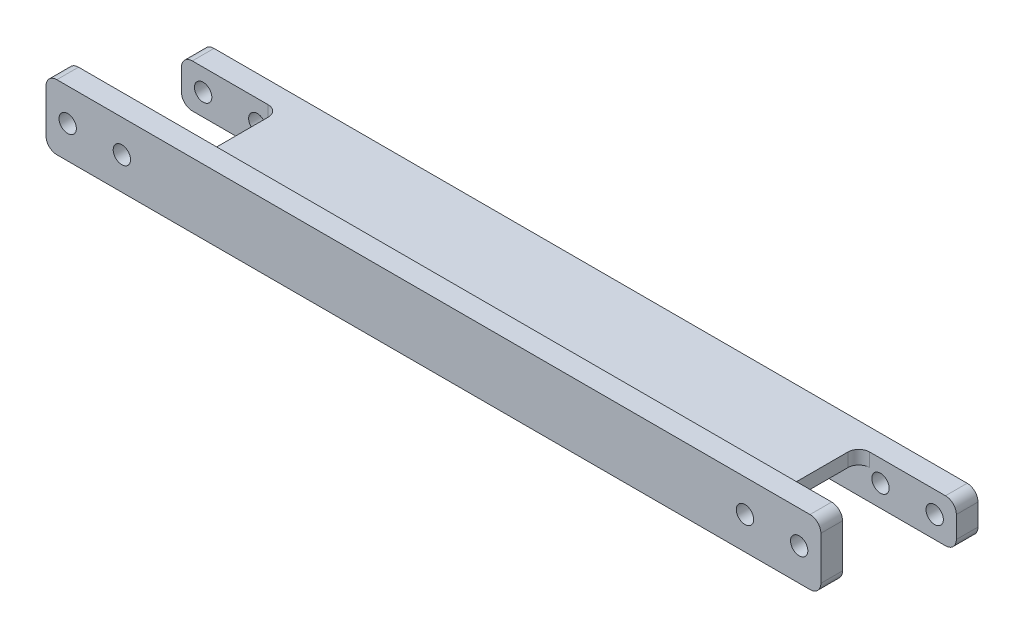
ISO-10303-21;
HEADER;
FILE_DESCRIPTION(('STEP AP214'),'2;1');
FILE_NAME('part.step','',(''),(''),'','','');
FILE_SCHEMA(('AUTOMOTIVE_DESIGN { 1 0 10303 214 1 1 1 1 }'));
ENDSEC;
DATA;
#1=APPLICATION_CONTEXT('core data for automotive mechanical design processes');
#2=APPLICATION_PROTOCOL_DEFINITION('international standard','automotive_design',2000,#1);
#3=PRODUCT_CONTEXT('',#1,'mechanical');
#4=PRODUCT('Part','Part','',(#3));
#5=PRODUCT_RELATED_PRODUCT_CATEGORY('part','',(#4));
#6=PRODUCT_DEFINITION_FORMATION('','',#4);
#7=PRODUCT_DEFINITION_CONTEXT('part definition',#1,'design');
#8=PRODUCT_DEFINITION('design','',#6,#7);
#9=PRODUCT_DEFINITION_SHAPE('','',#8);
#10=(LENGTH_UNIT() NAMED_UNIT(*) SI_UNIT(.MILLI.,.METRE.));
#11=(NAMED_UNIT(*) PLANE_ANGLE_UNIT() SI_UNIT($,.RADIAN.));
#12=(NAMED_UNIT(*) SI_UNIT($,.STERADIAN.) SOLID_ANGLE_UNIT());
#13=UNCERTAINTY_MEASURE_WITH_UNIT(LENGTH_MEASURE(1.E-05),#10,'distance_accuracy_value','');
#14=(GEOMETRIC_REPRESENTATION_CONTEXT(3) GLOBAL_UNCERTAINTY_ASSIGNED_CONTEXT((#13)) GLOBAL_UNIT_ASSIGNED_CONTEXT((#10,
#11,#12)) REPRESENTATION_CONTEXT('',''));
#15=CARTESIAN_POINT('',(0.,0.,0.));
#16=DIRECTION('',(0.,0.,1.));
#17=DIRECTION('',(1.,0.,0.));
#18=AXIS2_PLACEMENT_3D('',#15,#16,#17);
#19=CARTESIAN_POINT('',(0.,0.,4.));
#20=DIRECTION('',(0.,0.,1.));
#21=DIRECTION('',(1.,0.,0.));
#22=AXIS2_PLACEMENT_3D('',#19,#20,#21);
#23=PLANE('',#22);
#24=CARTESIAN_POINT('',(57.5,0.,4.));
#25=DIRECTION('',(0.,0.,1.));
#26=DIRECTION('',(1.,0.,0.));
#27=AXIS2_PLACEMENT_3D('',#24,#25,#26);
#28=CIRCLE('',#27,1.6);
#29=CARTESIAN_POINT('',(59.1,0.,4.));
#30=VERTEX_POINT('',#29);
#31=EDGE_CURVE('E266',#30,#30,#28,.T.);
#32=ORIENTED_EDGE('',*,*,#31,.F.);
#33=EDGE_LOOP('',(#32));
#34=FACE_BOUND('',#33,.T.);
#35=CARTESIAN_POINT('',(-67.5,0.,4.));
#36=DIRECTION('',(0.,0.,1.));
#37=DIRECTION('',(1.,0.,0.));
#38=AXIS2_PLACEMENT_3D('',#35,#36,#37);
#39=CIRCLE('',#38,1.60000000000001);
#40=CARTESIAN_POINT('',(-65.9,0.,4.));
#41=VERTEX_POINT('',#40);
#42=EDGE_CURVE('E278',#41,#41,#39,.T.);
#43=ORIENTED_EDGE('',*,*,#42,.F.);
#44=EDGE_LOOP('',(#43));
#45=FACE_BOUND('',#44,.T.);
#46=CARTESIAN_POINT('',(-57.5,0.,4.));
#47=DIRECTION('',(0.,0.,1.));
#48=DIRECTION('',(1.,0.,0.));
#49=AXIS2_PLACEMENT_3D('',#46,#47,#48);
#50=CIRCLE('',#49,1.6);
#51=CARTESIAN_POINT('',(-55.9,0.,4.));
#52=VERTEX_POINT('',#51);
#53=EDGE_CURVE('E272',#52,#52,#50,.T.);
#54=ORIENTED_EDGE('',*,*,#53,.F.);
#55=EDGE_LOOP('',(#54));
#56=FACE_BOUND('',#55,.T.);
#57=CARTESIAN_POINT('',(67.5,0.,4.));
#58=DIRECTION('',(0.,0.,1.));
#59=DIRECTION('',(1.,0.,0.));
#60=AXIS2_PLACEMENT_3D('',#57,#58,#59);
#61=CIRCLE('',#60,1.60000000000001);
#62=CARTESIAN_POINT('',(69.1,0.,4.));
#63=VERTEX_POINT('',#62);
#64=EDGE_CURVE('E260',#63,#63,#61,.T.);
#65=ORIENTED_EDGE('',*,*,#64,.F.);
#66=EDGE_LOOP('',(#65));
#67=FACE_BOUND('',#66,.T.);
#68=DIRECTION('',(-1.,0.,0.));
#69=VECTOR('',#68,1.);
#70=CARTESIAN_POINT('',(-71.5,4.,4.));
#71=LINE('',#70,#69);
#72=CARTESIAN_POINT('',(69.5,4.,4.));
#73=VERTEX_POINT('',#72);
#74=CARTESIAN_POINT('',(55.5,4.,4.));
#75=VERTEX_POINT('',#74);
#76=EDGE_CURVE('E291',#73,#75,#71,.T.);
#77=ORIENTED_EDGE('',*,*,#76,.T.);
#78=DIRECTION('',(0.,-1.,0.));
#79=VECTOR('',#78,1.);
#80=CARTESIAN_POINT('',(55.5,1.5,4.));
#81=LINE('',#80,#79);
#82=CARTESIAN_POINT('',(55.5,1.5,4.));
#83=VERTEX_POINT('',#82);
#84=EDGE_CURVE('E336',#75,#83,#81,.T.);
#85=ORIENTED_EDGE('',*,*,#84,.T.);
#86=DIRECTION('',(1.,0.,0.));
#87=VECTOR('',#86,1.);
#88=CARTESIAN_POINT('',(0.,1.5,4.));
#89=LINE('',#88,#87);
#90=CARTESIAN_POINT('',(-55.5,1.5,4.));
#91=VERTEX_POINT('',#90);
#92=EDGE_CURVE('E245',#91,#83,#89,.T.);
#93=ORIENTED_EDGE('',*,*,#92,.F.);
#94=DIRECTION('',(0.,-1.,0.));
#95=VECTOR('',#94,1.);
#96=CARTESIAN_POINT('',(-55.5,0.,4.));
#97=LINE('',#96,#95);
#98=CARTESIAN_POINT('',(-55.5,4.,4.));
#99=VERTEX_POINT('',#98);
#100=EDGE_CURVE('E334',#91,#99,#97,.F.);
#101=ORIENTED_EDGE('',*,*,#100,.T.);
#102=CARTESIAN_POINT('',(-69.5,4.,4.));
#103=VERTEX_POINT('',#102);
#104=EDGE_CURVE('E287',#99,#103,#71,.T.);
#105=ORIENTED_EDGE('',*,*,#104,.T.);
#106=CARTESIAN_POINT('',(-69.5,2.,4.));
#107=DIRECTION('',(0.,0.,1.));
#108=DIRECTION('',(1.,0.,0.));
#109=AXIS2_PLACEMENT_3D('',#106,#107,#108);
#110=CIRCLE('',#109,2.);
#111=CARTESIAN_POINT('',(-71.5,2.,4.));
#112=VERTEX_POINT('',#111);
#113=EDGE_CURVE('E330',#103,#112,#110,.T.);
#114=ORIENTED_EDGE('',*,*,#113,.T.);
#115=DIRECTION('',(0.,-1.,0.));
#116=VECTOR('',#115,1.);
#117=CARTESIAN_POINT('',(-71.5,4.,4.));
#118=LINE('',#117,#116);
#119=CARTESIAN_POINT('',(-71.5,-2.,4.));
#120=VERTEX_POINT('',#119);
#121=EDGE_CURVE('E292',#112,#120,#118,.T.);
#122=ORIENTED_EDGE('',*,*,#121,.T.);
#123=CARTESIAN_POINT('',(-69.5,-2.,4.));
#124=DIRECTION('',(0.,0.,1.));
#125=DIRECTION('',(1.,0.,0.));
#126=AXIS2_PLACEMENT_3D('',#123,#124,#125);
#127=CIRCLE('',#126,2.);
#128=CARTESIAN_POINT('',(-69.5,-4.,4.));
#129=VERTEX_POINT('',#128);
#130=EDGE_CURVE('E326',#120,#129,#127,.T.);
#131=ORIENTED_EDGE('',*,*,#130,.T.);
#132=DIRECTION('',(1.,0.,0.));
#133=VECTOR('',#132,1.);
#134=CARTESIAN_POINT('',(-71.5,-4.,4.));
#135=LINE('',#134,#133);
#136=CARTESIAN_POINT('',(69.5,-4.,4.));
#137=VERTEX_POINT('',#136);
#138=EDGE_CURVE('E215',#129,#137,#135,.T.);
#139=ORIENTED_EDGE('',*,*,#138,.T.);
#140=CARTESIAN_POINT('',(69.5,-2.,4.));
#141=DIRECTION('',(0.,0.,1.));
#142=DIRECTION('',(1.,0.,0.));
#143=AXIS2_PLACEMENT_3D('',#140,#141,#142);
#144=CIRCLE('',#143,2.);
#145=CARTESIAN_POINT('',(71.5,-2.,4.));
#146=VERTEX_POINT('',#145);
#147=EDGE_CURVE('E328',#137,#146,#144,.T.);
#148=ORIENTED_EDGE('',*,*,#147,.T.);
#149=DIRECTION('',(0.,1.,0.));
#150=VECTOR('',#149,1.);
#151=CARTESIAN_POINT('',(71.5,4.,4.));
#152=LINE('',#151,#150);
#153=CARTESIAN_POINT('',(71.5,2.,4.));
#154=VERTEX_POINT('',#153);
#155=EDGE_CURVE('E284',#146,#154,#152,.T.);
#156=ORIENTED_EDGE('',*,*,#155,.T.);
#157=CARTESIAN_POINT('',(69.5,2.,4.));
#158=DIRECTION('',(0.,0.,1.));
#159=DIRECTION('',(1.,0.,0.));
#160=AXIS2_PLACEMENT_3D('',#157,#158,#159);
#161=CIRCLE('',#160,2.);
#162=EDGE_CURVE('E332',#154,#73,#161,.T.);
#163=ORIENTED_EDGE('',*,*,#162,.T.);
#164=EDGE_LOOP('',(#77,#85,#93,#101,#105,#114,#122,#131,#139,#148,#156,#163));
#165=FACE_BOUND('',#164,.T.);
#166=ADVANCED_FACE('F43',(#34,#45,#56,#67,#165),#23,.T.);
#167=CARTESIAN_POINT('',(0.,0.,0.));
#168=DIRECTION('',(0.,0.,1.));
#169=DIRECTION('',(1.,0.,0.));
#170=AXIS2_PLACEMENT_3D('',#167,#168,#169);
#171=PLANE('',#170);
#172=DIRECTION('',(-1.,0.,0.));
#173=VECTOR('',#172,1.);
#174=CARTESIAN_POINT('',(-71.5,4.,0.));
#175=LINE('',#174,#173);
#176=CARTESIAN_POINT('',(69.5,4.,0.));
#177=VERTEX_POINT('',#176);
#178=CARTESIAN_POINT('',(-69.5,4.,0.));
#179=VERTEX_POINT('',#178);
#180=EDGE_CURVE('E299',#177,#179,#175,.T.);
#181=ORIENTED_EDGE('',*,*,#180,.F.);
#182=CARTESIAN_POINT('',(69.5,2.,0.));
#183=DIRECTION('',(0.,0.,1.));
#184=DIRECTION('',(1.,0.,0.));
#185=AXIS2_PLACEMENT_3D('',#182,#183,#184);
#186=CIRCLE('',#185,2.);
#187=CARTESIAN_POINT('',(71.5,2.,0.));
#188=VERTEX_POINT('',#187);
#189=EDGE_CURVE('E350',#177,#188,#186,.F.);
#190=ORIENTED_EDGE('',*,*,#189,.T.);
#191=DIRECTION('',(0.,1.,0.));
#192=VECTOR('',#191,1.);
#193=CARTESIAN_POINT('',(71.5,4.,0.));
#194=LINE('',#193,#192);
#195=CARTESIAN_POINT('',(71.5,-2.,0.));
#196=VERTEX_POINT('',#195);
#197=EDGE_CURVE('E281',#196,#188,#194,.T.);
#198=ORIENTED_EDGE('',*,*,#197,.F.);
#199=CARTESIAN_POINT('',(69.5,-2.,0.));
#200=DIRECTION('',(0.,0.,1.));
#201=DIRECTION('',(1.,0.,0.));
#202=AXIS2_PLACEMENT_3D('',#199,#200,#201);
#203=CIRCLE('',#202,2.);
#204=CARTESIAN_POINT('',(69.5,-4.,0.));
#205=VERTEX_POINT('',#204);
#206=EDGE_CURVE('E346',#196,#205,#203,.F.);
#207=ORIENTED_EDGE('',*,*,#206,.T.);
#208=DIRECTION('',(1.,0.,0.));
#209=VECTOR('',#208,1.);
#210=CARTESIAN_POINT('',(-71.5,-4.,0.));
#211=LINE('',#210,#209);
#212=CARTESIAN_POINT('',(-69.5,-4.,0.));
#213=VERTEX_POINT('',#212);
#214=EDGE_CURVE('E288',#213,#205,#211,.T.);
#215=ORIENTED_EDGE('',*,*,#214,.F.);
#216=CARTESIAN_POINT('',(-69.5,-2.,0.));
#217=DIRECTION('',(0.,0.,1.));
#218=DIRECTION('',(1.,0.,0.));
#219=AXIS2_PLACEMENT_3D('',#216,#217,#218);
#220=CIRCLE('',#219,2.);
#221=CARTESIAN_POINT('',(-71.5,-2.,0.));
#222=VERTEX_POINT('',#221);
#223=EDGE_CURVE('E344',#213,#222,#220,.F.);
#224=ORIENTED_EDGE('',*,*,#223,.T.);
#225=DIRECTION('',(0.,-1.,0.));
#226=VECTOR('',#225,1.);
#227=CARTESIAN_POINT('',(-71.5,4.,0.));
#228=LINE('',#227,#226);
#229=CARTESIAN_POINT('',(-71.5,2.,0.));
#230=VERTEX_POINT('',#229);
#231=EDGE_CURVE('E302',#230,#222,#228,.T.);
#232=ORIENTED_EDGE('',*,*,#231,.F.);
#233=CARTESIAN_POINT('',(-69.5,2.,0.));
#234=DIRECTION('',(0.,0.,1.));
#235=DIRECTION('',(1.,0.,0.));
#236=AXIS2_PLACEMENT_3D('',#233,#234,#235);
#237=CIRCLE('',#236,2.);
#238=EDGE_CURVE('E348',#230,#179,#237,.F.);
#239=ORIENTED_EDGE('',*,*,#238,.T.);
#240=EDGE_LOOP('',(#181,#190,#198,#207,#215,#224,#232,#239));
#241=FACE_BOUND('',#240,.T.);
#242=CARTESIAN_POINT('',(-67.5,0.,0.));
#243=DIRECTION('',(0.,0.,1.));
#244=DIRECTION('',(1.,0.,0.));
#245=AXIS2_PLACEMENT_3D('',#242,#243,#244);
#246=CIRCLE('',#245,1.60000000000001);
#247=CARTESIAN_POINT('',(-65.9,0.,0.));
#248=VERTEX_POINT('',#247);
#249=EDGE_CURVE('E275',#248,#248,#246,.T.);
#250=ORIENTED_EDGE('',*,*,#249,.T.);
#251=EDGE_LOOP('',(#250));
#252=FACE_BOUND('',#251,.T.);
#253=CARTESIAN_POINT('',(-57.5,0.,0.));
#254=DIRECTION('',(0.,0.,1.));
#255=DIRECTION('',(1.,0.,0.));
#256=AXIS2_PLACEMENT_3D('',#253,#254,#255);
#257=CIRCLE('',#256,1.6);
#258=CARTESIAN_POINT('',(-55.9,0.,0.));
#259=VERTEX_POINT('',#258);
#260=EDGE_CURVE('E269',#259,#259,#257,.T.);
#261=ORIENTED_EDGE('',*,*,#260,.T.);
#262=EDGE_LOOP('',(#261));
#263=FACE_BOUND('',#262,.T.);
#264=CARTESIAN_POINT('',(57.5,0.,0.));
#265=DIRECTION('',(0.,0.,1.));
#266=DIRECTION('',(1.,0.,0.));
#267=AXIS2_PLACEMENT_3D('',#264,#265,#266);
#268=CIRCLE('',#267,1.6);
#269=CARTESIAN_POINT('',(59.1,0.,0.));
#270=VERTEX_POINT('',#269);
#271=EDGE_CURVE('E263',#270,#270,#268,.T.);
#272=ORIENTED_EDGE('',*,*,#271,.T.);
#273=EDGE_LOOP('',(#272));
#274=FACE_BOUND('',#273,.T.);
#275=CARTESIAN_POINT('',(67.5,0.,0.));
#276=DIRECTION('',(0.,0.,1.));
#277=DIRECTION('',(1.,0.,0.));
#278=AXIS2_PLACEMENT_3D('',#275,#276,#277);
#279=CIRCLE('',#278,1.60000000000001);
#280=CARTESIAN_POINT('',(69.1,0.,0.));
#281=VERTEX_POINT('',#280);
#282=EDGE_CURVE('E259',#281,#281,#279,.T.);
#283=ORIENTED_EDGE('',*,*,#282,.T.);
#284=EDGE_LOOP('',(#283));
#285=FACE_BOUND('',#284,.T.);
#286=ADVANCED_FACE('F520',(#241,#252,#263,#274,#285),#171,.F.);
#287=CARTESIAN_POINT('',(71.5,4.,4.));
#288=DIRECTION('',(-1.,0.,0.));
#289=DIRECTION('',(0.,0.,1.));
#290=AXIS2_PLACEMENT_3D('',#287,#288,#289);
#291=PLANE('',#290);
#292=ORIENTED_EDGE('',*,*,#197,.T.);
#293=DIRECTION('',(0.,0.,-1.));
#294=VECTOR('',#293,1.);
#295=CARTESIAN_POINT('',(71.5,2.,4.));
#296=LINE('',#295,#294);
#297=EDGE_CURVE('E355',#188,#154,#296,.F.);
#298=ORIENTED_EDGE('',*,*,#297,.T.);
#299=ORIENTED_EDGE('',*,*,#155,.F.);
#300=DIRECTION('',(0.,0.,-1.));
#301=VECTOR('',#300,1.);
#302=CARTESIAN_POINT('',(71.5,-2.,4.));
#303=LINE('',#302,#301);
#304=EDGE_CURVE('E352',#146,#196,#303,.T.);
#305=ORIENTED_EDGE('',*,*,#304,.T.);
#306=EDGE_LOOP('',(#292,#298,#299,#305));
#307=FACE_BOUND('',#306,.T.);
#308=ADVANCED_FACE('F442',(#307),#291,.F.);
#309=CARTESIAN_POINT('',(-71.5,4.,4.));
#310=DIRECTION('',(0.,-1.,0.));
#311=DIRECTION('',(0.,0.,-1.));
#312=AXIS2_PLACEMENT_3D('',#309,#310,#311);
#313=PLANE('',#312);
#314=ORIENTED_EDGE('',*,*,#76,.F.);
#315=DIRECTION('',(0.,0.,-1.));
#316=VECTOR('',#315,1.);
#317=CARTESIAN_POINT('',(69.5,4.,4.));
#318=LINE('',#317,#316);
#319=EDGE_CURVE('E341',#73,#177,#318,.T.);
#320=ORIENTED_EDGE('',*,*,#319,.T.);
#321=ORIENTED_EDGE('',*,*,#180,.T.);
#322=DIRECTION('',(0.,0.,-1.));
#323=VECTOR('',#322,1.);
#324=CARTESIAN_POINT('',(-69.5,4.,4.));
#325=LINE('',#324,#323);
#326=EDGE_CURVE('E339',#179,#103,#325,.F.);
#327=ORIENTED_EDGE('',*,*,#326,.T.);
#328=ORIENTED_EDGE('',*,*,#104,.F.);
#329=CARTESIAN_POINT('',(-55.5,4.,6.));
#330=DIRECTION('',(0.,-1.,0.));
#331=DIRECTION('',(0.,0.,-1.));
#332=AXIS2_PLACEMENT_3D('',#329,#330,#331);
#333=CIRCLE('',#332,2.);
#334=CARTESIAN_POINT('',(-53.5,4.,6.00000000000001));
#335=VERTEX_POINT('',#334);
#336=EDGE_CURVE('E11',#99,#335,#333,.T.);
#337=ORIENTED_EDGE('',*,*,#336,.T.);
#338=DIRECTION('',(0.,0.,-1.));
#339=VECTOR('',#338,1.);
#340=CARTESIAN_POINT('',(-53.5,4.,25.));
#341=LINE('',#340,#339);
#342=CARTESIAN_POINT('',(-53.5,4.,23.));
#343=VERTEX_POINT('',#342);
#344=EDGE_CURVE('E253',#343,#335,#341,.T.);
#345=ORIENTED_EDGE('',*,*,#344,.F.);
#346=CARTESIAN_POINT('',(-55.5,4.,23.));
#347=DIRECTION('',(0.,-1.,0.));
#348=DIRECTION('',(0.,0.,-1.));
#349=AXIS2_PLACEMENT_3D('',#346,#347,#348);
#350=CIRCLE('',#349,2.);
#351=CARTESIAN_POINT('',(-55.5,4.,25.));
#352=VERTEX_POINT('',#351);
#353=EDGE_CURVE('E390',#343,#352,#350,.T.);
#354=ORIENTED_EDGE('',*,*,#353,.T.);
#355=DIRECTION('',(-1.,0.,0.));
#356=VECTOR('',#355,1.);
#357=CARTESIAN_POINT('',(0.,4.,25.));
#358=LINE('',#357,#356);
#359=CARTESIAN_POINT('',(55.5,4.,25.));
#360=VERTEX_POINT('',#359);
#361=EDGE_CURVE('E242',#360,#352,#358,.T.);
#362=ORIENTED_EDGE('',*,*,#361,.F.);
#363=CARTESIAN_POINT('',(55.5,4.,23.));
#364=DIRECTION('',(0.,-1.,0.));
#365=DIRECTION('',(0.,0.,-1.));
#366=AXIS2_PLACEMENT_3D('',#363,#364,#365);
#367=CIRCLE('',#366,2.);
#368=CARTESIAN_POINT('',(53.5,4.,23.));
#369=VERTEX_POINT('',#368);
#370=EDGE_CURVE('E395',#360,#369,#367,.T.);
#371=ORIENTED_EDGE('',*,*,#370,.T.);
#372=DIRECTION('',(0.,0.,-1.));
#373=VECTOR('',#372,1.);
#374=CARTESIAN_POINT('',(53.5,4.,25.));
#375=LINE('',#374,#373);
#376=CARTESIAN_POINT('',(53.5,4.,6.00000000000001));
#377=VERTEX_POINT('',#376);
#378=EDGE_CURVE('E256',#369,#377,#375,.T.);
#379=ORIENTED_EDGE('',*,*,#378,.T.);
#380=CARTESIAN_POINT('',(55.5,4.,6.));
#381=DIRECTION('',(0.,-1.,0.));
#382=DIRECTION('',(0.,0.,-1.));
#383=AXIS2_PLACEMENT_3D('',#380,#381,#382);
#384=CIRCLE('',#383,2.);
#385=EDGE_CURVE('E399',#377,#75,#384,.T.);
#386=ORIENTED_EDGE('',*,*,#385,.T.);
#387=EDGE_LOOP('',(#314,#320,#321,#327,#328,#337,#345,#354,#362,#371,#379,#386));
#388=FACE_BOUND('',#387,.T.);
#389=ADVANCED_FACE('F414',(#388),#313,.F.);
#390=CARTESIAN_POINT('',(-71.5,4.,4.));
#391=DIRECTION('',(1.,0.,0.));
#392=DIRECTION('',(0.,0.,-1.));
#393=AXIS2_PLACEMENT_3D('',#390,#391,#392);
#394=PLANE('',#393);
#395=ORIENTED_EDGE('',*,*,#121,.F.);
#396=DIRECTION('',(0.,0.,-1.));
#397=VECTOR('',#396,1.);
#398=CARTESIAN_POINT('',(-71.5,2.,4.));
#399=LINE('',#398,#397);
#400=EDGE_CURVE('E359',#112,#230,#399,.T.);
#401=ORIENTED_EDGE('',*,*,#400,.T.);
#402=ORIENTED_EDGE('',*,*,#231,.T.);
#403=DIRECTION('',(0.,0.,-1.));
#404=VECTOR('',#403,1.);
#405=CARTESIAN_POINT('',(-71.5,-2.,4.));
#406=LINE('',#405,#404);
#407=EDGE_CURVE('E357',#222,#120,#406,.F.);
#408=ORIENTED_EDGE('',*,*,#407,.T.);
#409=EDGE_LOOP('',(#395,#401,#402,#408));
#410=FACE_BOUND('',#409,.T.);
#411=ADVANCED_FACE('F424',(#410),#394,.F.);
#412=CARTESIAN_POINT('',(-71.5,-4.,4.));
#413=DIRECTION('',(0.,1.,0.));
#414=DIRECTION('',(0.,0.,1.));
#415=AXIS2_PLACEMENT_3D('',#412,#413,#414);
#416=PLANE('',#415);
#417=ORIENTED_EDGE('',*,*,#214,.T.);
#418=DIRECTION('',(0.,0.,-1.));
#419=VECTOR('',#418,1.);
#420=CARTESIAN_POINT('',(69.5,-4.,4.));
#421=LINE('',#420,#419);
#422=EDGE_CURVE('E365',#205,#137,#421,.F.);
#423=ORIENTED_EDGE('',*,*,#422,.T.);
#424=ORIENTED_EDGE('',*,*,#138,.F.);
#425=DIRECTION('',(0.,0.,-1.));
#426=VECTOR('',#425,1.);
#427=CARTESIAN_POINT('',(-69.5,-4.,4.));
#428=LINE('',#427,#426);
#429=EDGE_CURVE('E362',#129,#213,#428,.T.);
#430=ORIENTED_EDGE('',*,*,#429,.T.);
#431=EDGE_LOOP('',(#417,#423,#424,#430));
#432=FACE_BOUND('',#431,.T.);
#433=ADVANCED_FACE('F433',(#432),#416,.F.);
#434=CARTESIAN_POINT('',(-67.5,0.,4.));
#435=DIRECTION('',(0.,0.,-1.));
#436=DIRECTION('',(-1.,0.,0.));
#437=AXIS2_PLACEMENT_3D('',#434,#435,#436);
#438=CYLINDRICAL_SURFACE('',#437,1.60000000000001);
#439=ORIENTED_EDGE('',*,*,#42,.T.);
#440=EDGE_LOOP('',(#439));
#441=FACE_BOUND('',#440,.T.);
#442=ORIENTED_EDGE('',*,*,#249,.F.);
#443=EDGE_LOOP('',(#442));
#444=FACE_BOUND('',#443,.T.);
#445=ADVANCED_FACE('F531',(#441,#444),#438,.F.);
#446=CARTESIAN_POINT('',(-57.5,0.,4.));
#447=DIRECTION('',(0.,0.,-1.));
#448=DIRECTION('',(-1.,0.,0.));
#449=AXIS2_PLACEMENT_3D('',#446,#447,#448);
#450=CYLINDRICAL_SURFACE('',#449,1.6);
#451=ORIENTED_EDGE('',*,*,#53,.T.);
#452=EDGE_LOOP('',(#451));
#453=FACE_BOUND('',#452,.T.);
#454=ORIENTED_EDGE('',*,*,#260,.F.);
#455=EDGE_LOOP('',(#454));
#456=FACE_BOUND('',#455,.T.);
#457=ADVANCED_FACE('F821',(#453,#456),#450,.F.);
#458=CARTESIAN_POINT('',(57.5,0.,4.));
#459=DIRECTION('',(0.,0.,-1.));
#460=DIRECTION('',(-1.,0.,0.));
#461=AXIS2_PLACEMENT_3D('',#458,#459,#460);
#462=CYLINDRICAL_SURFACE('',#461,1.6);
#463=ORIENTED_EDGE('',*,*,#31,.T.);
#464=EDGE_LOOP('',(#463));
#465=FACE_BOUND('',#464,.T.);
#466=ORIENTED_EDGE('',*,*,#271,.F.);
#467=EDGE_LOOP('',(#466));
#468=FACE_BOUND('',#467,.T.);
#469=ADVANCED_FACE('F811',(#465,#468),#462,.F.);
#470=CARTESIAN_POINT('',(67.5,0.,4.));
#471=DIRECTION('',(0.,0.,-1.));
#472=DIRECTION('',(-1.,0.,0.));
#473=AXIS2_PLACEMENT_3D('',#470,#471,#472);
#474=CYLINDRICAL_SURFACE('',#473,1.60000000000001);
#475=ORIENTED_EDGE('',*,*,#64,.T.);
#476=EDGE_LOOP('',(#475));
#477=FACE_BOUND('',#476,.T.);
#478=ORIENTED_EDGE('',*,*,#282,.F.);
#479=EDGE_LOOP('',(#478));
#480=FACE_BOUND('',#479,.T.);
#481=ADVANCED_FACE('F722',(#477,#480),#474,.F.);
#482=CARTESIAN_POINT('',(53.5,0.,25.));
#483=DIRECTION('',(1.,0.,0.));
#484=DIRECTION('',(0.,0.,-1.));
#485=AXIS2_PLACEMENT_3D('',#482,#483,#484);
#486=PLANE('',#485);
#487=ORIENTED_EDGE('',*,*,#378,.F.);
#488=DIRECTION('',(0.,-1.,0.));
#489=VECTOR('',#488,1.);
#490=CARTESIAN_POINT('',(53.5,1.5,23.));
#491=LINE('',#490,#489);
#492=CARTESIAN_POINT('',(53.5,1.5,23.));
#493=VERTEX_POINT('',#492);
#494=EDGE_CURVE('E323',#369,#493,#491,.T.);
#495=ORIENTED_EDGE('',*,*,#494,.T.);
#496=DIRECTION('',(0.,0.,-1.));
#497=VECTOR('',#496,1.);
#498=CARTESIAN_POINT('',(53.5,1.5,25.));
#499=LINE('',#498,#497);
#500=CARTESIAN_POINT('',(53.5,1.5,6.00000000000001));
#501=VERTEX_POINT('',#500);
#502=EDGE_CURVE('E244',#493,#501,#499,.T.);
#503=ORIENTED_EDGE('',*,*,#502,.T.);
#504=DIRECTION('',(0.,-1.,0.));
#505=VECTOR('',#504,1.);
#506=CARTESIAN_POINT('',(53.5,4.,6.));
#507=LINE('',#506,#505);
#508=EDGE_CURVE('E321',#501,#377,#507,.F.);
#509=ORIENTED_EDGE('',*,*,#508,.T.);
#510=EDGE_LOOP('',(#487,#495,#503,#509));
#511=FACE_BOUND('',#510,.T.);
#512=ADVANCED_FACE('F456',(#511),#486,.T.);
#513=CARTESIAN_POINT('',(-53.5,0.,25.));
#514=DIRECTION('',(1.,0.,0.));
#515=DIRECTION('',(0.,0.,-1.));
#516=AXIS2_PLACEMENT_3D('',#513,#514,#515);
#517=PLANE('',#516);
#518=DIRECTION('',(0.,0.,-1.));
#519=VECTOR('',#518,1.);
#520=CARTESIAN_POINT('',(-53.5,1.5,25.));
#521=LINE('',#520,#519);
#522=CARTESIAN_POINT('',(-53.5,1.5,23.));
#523=VERTEX_POINT('',#522);
#524=CARTESIAN_POINT('',(-53.5,1.5,6.00000000000001));
#525=VERTEX_POINT('',#524);
#526=EDGE_CURVE('E250',#523,#525,#521,.T.);
#527=ORIENTED_EDGE('',*,*,#526,.F.);
#528=DIRECTION('',(0.,-1.,0.));
#529=VECTOR('',#528,1.);
#530=CARTESIAN_POINT('',(-53.5,0.,23.));
#531=LINE('',#530,#529);
#532=EDGE_CURVE('E319',#523,#343,#531,.F.);
#533=ORIENTED_EDGE('',*,*,#532,.T.);
#534=ORIENTED_EDGE('',*,*,#344,.T.);
#535=DIRECTION('',(0.,-1.,0.));
#536=VECTOR('',#535,1.);
#537=CARTESIAN_POINT('',(-53.5,0.,6.));
#538=LINE('',#537,#536);
#539=EDGE_CURVE('E316',#335,#525,#538,.T.);
#540=ORIENTED_EDGE('',*,*,#539,.T.);
#541=EDGE_LOOP('',(#527,#533,#534,#540));
#542=FACE_BOUND('',#541,.T.);
#543=ADVANCED_FACE('F702',(#542),#517,.F.);
#544=CARTESIAN_POINT('',(0.,1.5,25.));
#545=DIRECTION('',(0.,1.,0.));
#546=DIRECTION('',(0.,0.,1.));
#547=AXIS2_PLACEMENT_3D('',#544,#545,#546);
#548=PLANE('',#547);
#549=DIRECTION('',(1.,0.,0.));
#550=VECTOR('',#549,1.);
#551=CARTESIAN_POINT('',(71.5,1.5,25.));
#552=LINE('',#551,#550);
#553=CARTESIAN_POINT('',(55.5,1.5,25.));
#554=VERTEX_POINT('',#553);
#555=CARTESIAN_POINT('',(69.5,1.5,25.));
#556=VERTEX_POINT('',#555);
#557=EDGE_CURVE('E231',#554,#556,#552,.T.);
#558=ORIENTED_EDGE('',*,*,#557,.T.);
#559=DIRECTION('',(0.,0.,-1.));
#560=VECTOR('',#559,1.);
#561=CARTESIAN_POINT('',(69.5,1.5,25.));
#562=LINE('',#561,#560);
#563=CARTESIAN_POINT('',(69.5,1.5,29.));
#564=VERTEX_POINT('',#563);
#565=EDGE_CURVE('E224',#556,#564,#562,.F.);
#566=ORIENTED_EDGE('',*,*,#565,.T.);
#567=DIRECTION('',(1.,0.,0.));
#568=VECTOR('',#567,1.);
#569=CARTESIAN_POINT('',(71.5,1.5,29.));
#570=LINE('',#569,#568);
#571=CARTESIAN_POINT('',(-69.5,1.5,29.));
#572=VERTEX_POINT('',#571);
#573=EDGE_CURVE('E223',#572,#564,#570,.T.);
#574=ORIENTED_EDGE('',*,*,#573,.F.);
#575=DIRECTION('',(0.,0.,-1.));
#576=VECTOR('',#575,1.);
#577=CARTESIAN_POINT('',(-69.5,1.5,25.));
#578=LINE('',#577,#576);
#579=CARTESIAN_POINT('',(-69.5,1.5,25.));
#580=VERTEX_POINT('',#579);
#581=EDGE_CURVE('E208',#572,#580,#578,.T.);
#582=ORIENTED_EDGE('',*,*,#581,.T.);
#583=CARTESIAN_POINT('',(-55.5,1.5,25.));
#584=VERTEX_POINT('',#583);
#585=EDGE_CURVE('E222',#580,#584,#552,.T.);
#586=ORIENTED_EDGE('',*,*,#585,.T.);
#587=CARTESIAN_POINT('',(-55.5,1.5,23.));
#588=DIRECTION('',(0.,1.,0.));
#589=DIRECTION('',(0.,0.,1.));
#590=AXIS2_PLACEMENT_3D('',#587,#588,#589);
#591=CIRCLE('',#590,2.);
#592=EDGE_CURVE('E388',#584,#523,#591,.T.);
#593=ORIENTED_EDGE('',*,*,#592,.T.);
#594=ORIENTED_EDGE('',*,*,#526,.T.);
#595=CARTESIAN_POINT('',(-55.5,1.5,6.));
#596=DIRECTION('',(0.,1.,0.));
#597=DIRECTION('',(0.,0.,1.));
#598=AXIS2_PLACEMENT_3D('',#595,#596,#597);
#599=CIRCLE('',#598,2.);
#600=EDGE_CURVE('E51',#525,#91,#599,.T.);
#601=ORIENTED_EDGE('',*,*,#600,.T.);
#602=ORIENTED_EDGE('',*,*,#92,.T.);
#603=CARTESIAN_POINT('',(55.5,1.5,6.));
#604=DIRECTION('',(0.,1.,0.));
#605=DIRECTION('',(0.,0.,1.));
#606=AXIS2_PLACEMENT_3D('',#603,#604,#605);
#607=CIRCLE('',#606,2.);
#608=EDGE_CURVE('E397',#83,#501,#607,.T.);
#609=ORIENTED_EDGE('',*,*,#608,.T.);
#610=ORIENTED_EDGE('',*,*,#502,.F.);
#611=CARTESIAN_POINT('',(55.5,1.5,23.));
#612=DIRECTION('',(0.,1.,0.));
#613=DIRECTION('',(0.,0.,1.));
#614=AXIS2_PLACEMENT_3D('',#611,#612,#613);
#615=CIRCLE('',#614,2.);
#616=EDGE_CURVE('E393',#493,#554,#615,.T.);
#617=ORIENTED_EDGE('',*,*,#616,.T.);
#618=EDGE_LOOP('',(#558,#566,#574,#582,#586,#593,#594,#601,#602,#609,#610,#617));
#619=FACE_BOUND('',#618,.T.);
#620=ADVANCED_FACE('F221',(#619),#548,.F.);
#621=CARTESIAN_POINT('',(0.,0.,25.));
#622=DIRECTION('',(0.,0.,-1.));
#623=DIRECTION('',(-1.,0.,0.));
#624=AXIS2_PLACEMENT_3D('',#621,#622,#623);
#625=PLANE('',#624);
#626=CARTESIAN_POINT('',(-57.5,7.5,25.));
#627=DIRECTION('',(0.,0.,1.));
#628=DIRECTION('',(1.,0.,0.));
#629=AXIS2_PLACEMENT_3D('',#626,#627,#628);
#630=CIRCLE('',#629,1.6);
#631=CARTESIAN_POINT('',(-55.9,7.5,25.));
#632=VERTEX_POINT('',#631);
#633=EDGE_CURVE('E496',#632,#632,#630,.T.);
#634=ORIENTED_EDGE('',*,*,#633,.T.);
#635=EDGE_LOOP('',(#634));
#636=FACE_BOUND('',#635,.T.);
#637=CARTESIAN_POINT('',(57.5,7.5,25.));
#638=DIRECTION('',(0.,0.,1.));
#639=DIRECTION('',(1.,0.,0.));
#640=AXIS2_PLACEMENT_3D('',#637,#638,#639);
#641=CIRCLE('',#640,1.6);
#642=CARTESIAN_POINT('',(59.1,7.5,25.));
#643=VERTEX_POINT('',#642);
#644=EDGE_CURVE('E484',#643,#643,#641,.T.);
#645=ORIENTED_EDGE('',*,*,#644,.T.);
#646=EDGE_LOOP('',(#645));
#647=FACE_BOUND('',#646,.T.);
#648=CARTESIAN_POINT('',(67.5,7.5,25.));
#649=DIRECTION('',(0.,0.,1.));
#650=DIRECTION('',(1.,0.,0.));
#651=AXIS2_PLACEMENT_3D('',#648,#649,#650);
#652=CIRCLE('',#651,1.6);
#653=CARTESIAN_POINT('',(69.1,7.5,25.));
#654=VERTEX_POINT('',#653);
#655=EDGE_CURVE('E477',#654,#654,#652,.T.);
#656=ORIENTED_EDGE('',*,*,#655,.T.);
#657=EDGE_LOOP('',(#656));
#658=FACE_BOUND('',#657,.T.);
#659=CARTESIAN_POINT('',(-67.5,7.5,25.));
#660=DIRECTION('',(0.,0.,1.));
#661=DIRECTION('',(1.,0.,0.));
#662=AXIS2_PLACEMENT_3D('',#659,#660,#661);
#663=CIRCLE('',#662,1.60000000000001);
#664=CARTESIAN_POINT('',(-65.9,7.5,25.));
#665=VERTEX_POINT('',#664);
#666=EDGE_CURVE('E490',#665,#665,#663,.T.);
#667=ORIENTED_EDGE('',*,*,#666,.T.);
#668=EDGE_LOOP('',(#667));
#669=FACE_BOUND('',#668,.T.);
#670=ORIENTED_EDGE('',*,*,#361,.T.);
#671=DIRECTION('',(0.,-1.,0.));
#672=VECTOR('',#671,1.);
#673=CARTESIAN_POINT('',(-55.5,0.,25.));
#674=LINE('',#673,#672);
#675=EDGE_CURVE('E229',#352,#584,#674,.T.);
#676=ORIENTED_EDGE('',*,*,#675,.T.);
#677=ORIENTED_EDGE('',*,*,#585,.F.);
#678=CARTESIAN_POINT('',(-69.5,3.5,25.));
#679=DIRECTION('',(0.,0.,-1.));
#680=DIRECTION('',(-1.,0.,0.));
#681=AXIS2_PLACEMENT_3D('',#678,#679,#680);
#682=CIRCLE('',#681,2.);
#683=CARTESIAN_POINT('',(-71.5,3.5,25.));
#684=VERTEX_POINT('',#683);
#685=EDGE_CURVE('E205',#580,#684,#682,.T.);
#686=ORIENTED_EDGE('',*,*,#685,.T.);
#687=DIRECTION('',(0.,-1.,0.));
#688=VECTOR('',#687,1.);
#689=CARTESIAN_POINT('',(-71.5,13.5,25.));
#690=LINE('',#689,#688);
#691=CARTESIAN_POINT('',(-71.5,11.5,25.));
#692=VERTEX_POINT('',#691);
#693=EDGE_CURVE('E235',#692,#684,#690,.T.);
#694=ORIENTED_EDGE('',*,*,#693,.F.);
#695=CARTESIAN_POINT('',(-69.5,11.5,25.));
#696=DIRECTION('',(0.,0.,-1.));
#697=DIRECTION('',(-1.,0.,0.));
#698=AXIS2_PLACEMENT_3D('',#695,#696,#697);
#699=CIRCLE('',#698,2.);
#700=CARTESIAN_POINT('',(-69.5,13.5,25.));
#701=VERTEX_POINT('',#700);
#702=EDGE_CURVE('E310',#692,#701,#699,.T.);
#703=ORIENTED_EDGE('',*,*,#702,.T.);
#704=DIRECTION('',(-1.,0.,0.));
#705=VECTOR('',#704,1.);
#706=CARTESIAN_POINT('',(71.5,13.5,25.));
#707=LINE('',#706,#705);
#708=CARTESIAN_POINT('',(69.5,13.5,25.));
#709=VERTEX_POINT('',#708);
#710=EDGE_CURVE('E233',#709,#701,#707,.T.);
#711=ORIENTED_EDGE('',*,*,#710,.F.);
#712=CARTESIAN_POINT('',(69.5,11.5,25.));
#713=DIRECTION('',(0.,0.,-1.));
#714=DIRECTION('',(-1.,0.,0.));
#715=AXIS2_PLACEMENT_3D('',#712,#713,#714);
#716=CIRCLE('',#715,2.);
#717=CARTESIAN_POINT('',(71.5,11.5,25.));
#718=VERTEX_POINT('',#717);
#719=EDGE_CURVE('E308',#709,#718,#716,.T.);
#720=ORIENTED_EDGE('',*,*,#719,.T.);
#721=DIRECTION('',(0.,1.,0.));
#722=VECTOR('',#721,1.);
#723=CARTESIAN_POINT('',(71.5,13.5,25.));
#724=LINE('',#723,#722);
#725=CARTESIAN_POINT('',(71.5,3.5,25.));
#726=VERTEX_POINT('',#725);
#727=EDGE_CURVE('E230',#726,#718,#724,.T.);
#728=ORIENTED_EDGE('',*,*,#727,.F.);
#729=CARTESIAN_POINT('',(69.5,3.5,25.));
#730=DIRECTION('',(0.,0.,-1.));
#731=DIRECTION('',(-1.,0.,0.));
#732=AXIS2_PLACEMENT_3D('',#729,#730,#731);
#733=CIRCLE('',#732,2.);
#734=EDGE_CURVE('E214',#726,#556,#733,.T.);
#735=ORIENTED_EDGE('',*,*,#734,.T.);
#736=ORIENTED_EDGE('',*,*,#557,.F.);
#737=DIRECTION('',(0.,-1.,0.));
#738=VECTOR('',#737,1.);
#739=CARTESIAN_POINT('',(55.5,4.,25.));
#740=LINE('',#739,#738);
#741=EDGE_CURVE('E312',#554,#360,#740,.F.);
#742=ORIENTED_EDGE('',*,*,#741,.T.);
#743=EDGE_LOOP('',(#670,#676,#677,#686,#694,#703,#711,#720,#728,#735,#736,#742));
#744=FACE_BOUND('',#743,.T.);
#745=ADVANCED_FACE('F227',(#636,#647,#658,#669,#744),#625,.T.);
#746=CARTESIAN_POINT('',(0.,0.,29.));
#747=DIRECTION('',(0.,0.,-1.));
#748=DIRECTION('',(-1.,0.,0.));
#749=AXIS2_PLACEMENT_3D('',#746,#747,#748);
#750=PLANE('',#749);
#751=DIRECTION('',(-1.,0.,0.));
#752=VECTOR('',#751,1.);
#753=CARTESIAN_POINT('',(71.5,13.5,29.));
#754=LINE('',#753,#752);
#755=CARTESIAN_POINT('',(69.5,13.5,29.));
#756=VERTEX_POINT('',#755);
#757=CARTESIAN_POINT('',(-69.5,13.5,29.));
#758=VERTEX_POINT('',#757);
#759=EDGE_CURVE('E247',#756,#758,#754,.T.);
#760=ORIENTED_EDGE('',*,*,#759,.T.);
#761=CARTESIAN_POINT('',(-69.5,11.5,29.));
#762=DIRECTION('',(0.,0.,-1.));
#763=DIRECTION('',(-1.,0.,0.));
#764=AXIS2_PLACEMENT_3D('',#761,#762,#763);
#765=CIRCLE('',#764,2.);
#766=CARTESIAN_POINT('',(-71.5,11.5,29.));
#767=VERTEX_POINT('',#766);
#768=EDGE_CURVE('E381',#758,#767,#765,.F.);
#769=ORIENTED_EDGE('',*,*,#768,.T.);
#770=DIRECTION('',(0.,-1.,0.));
#771=VECTOR('',#770,1.);
#772=CARTESIAN_POINT('',(-71.5,13.5,29.));
#773=LINE('',#772,#771);
#774=CARTESIAN_POINT('',(-71.5,3.5,29.));
#775=VERTEX_POINT('',#774);
#776=EDGE_CURVE('E241',#767,#775,#773,.T.);
#777=ORIENTED_EDGE('',*,*,#776,.T.);
#778=CARTESIAN_POINT('',(-69.5,3.5,29.));
#779=DIRECTION('',(0.,0.,-1.));
#780=DIRECTION('',(-1.,0.,0.));
#781=AXIS2_PLACEMENT_3D('',#778,#779,#780);
#782=CIRCLE('',#781,2.);
#783=EDGE_CURVE('E376',#775,#572,#782,.F.);
#784=ORIENTED_EDGE('',*,*,#783,.T.);
#785=ORIENTED_EDGE('',*,*,#573,.T.);
#786=CARTESIAN_POINT('',(69.5,3.5,29.));
#787=DIRECTION('',(0.,0.,-1.));
#788=DIRECTION('',(-1.,0.,0.));
#789=AXIS2_PLACEMENT_3D('',#786,#787,#788);
#790=CIRCLE('',#789,2.);
#791=CARTESIAN_POINT('',(71.5,3.5,29.));
#792=VERTEX_POINT('',#791);
#793=EDGE_CURVE('E65',#564,#792,#790,.F.);
#794=ORIENTED_EDGE('',*,*,#793,.T.);
#795=DIRECTION('',(0.,1.,0.));
#796=VECTOR('',#795,1.);
#797=CARTESIAN_POINT('',(71.5,13.5,29.));
#798=LINE('',#797,#796);
#799=CARTESIAN_POINT('',(71.5,11.5,29.));
#800=VERTEX_POINT('',#799);
#801=EDGE_CURVE('E469',#792,#800,#798,.T.);
#802=ORIENTED_EDGE('',*,*,#801,.T.);
#803=CARTESIAN_POINT('',(69.5,11.5,29.));
#804=DIRECTION('',(0.,0.,-1.));
#805=DIRECTION('',(-1.,0.,0.));
#806=AXIS2_PLACEMENT_3D('',#803,#804,#805);
#807=CIRCLE('',#806,2.);
#808=EDGE_CURVE('E379',#800,#756,#807,.F.);
#809=ORIENTED_EDGE('',*,*,#808,.T.);
#810=EDGE_LOOP('',(#760,#769,#777,#784,#785,#794,#802,#809));
#811=FACE_BOUND('',#810,.T.);
#812=CARTESIAN_POINT('',(67.5,7.5,29.));
#813=DIRECTION('',(0.,0.,1.));
#814=DIRECTION('',(1.,0.,0.));
#815=AXIS2_PLACEMENT_3D('',#812,#813,#814);
#816=CIRCLE('',#815,1.6);
#817=CARTESIAN_POINT('',(69.1,7.5,29.));
#818=VERTEX_POINT('',#817);
#819=EDGE_CURVE('E480',#818,#818,#816,.T.);
#820=ORIENTED_EDGE('',*,*,#819,.F.);
#821=EDGE_LOOP('',(#820));
#822=FACE_BOUND('',#821,.T.);
#823=CARTESIAN_POINT('',(57.5,7.5,29.));
#824=DIRECTION('',(0.,0.,1.));
#825=DIRECTION('',(1.,0.,0.));
#826=AXIS2_PLACEMENT_3D('',#823,#824,#825);
#827=CIRCLE('',#826,1.6);
#828=CARTESIAN_POINT('',(59.1,7.5,29.));
#829=VERTEX_POINT('',#828);
#830=EDGE_CURVE('E481',#829,#829,#827,.T.);
#831=ORIENTED_EDGE('',*,*,#830,.F.);
#832=EDGE_LOOP('',(#831));
#833=FACE_BOUND('',#832,.T.);
#834=CARTESIAN_POINT('',(-67.5,7.5,29.));
#835=DIRECTION('',(0.,0.,1.));
#836=DIRECTION('',(1.,0.,0.));
#837=AXIS2_PLACEMENT_3D('',#834,#835,#836);
#838=CIRCLE('',#837,1.60000000000001);
#839=CARTESIAN_POINT('',(-65.9,7.5,29.));
#840=VERTEX_POINT('',#839);
#841=EDGE_CURVE('E487',#840,#840,#838,.T.);
#842=ORIENTED_EDGE('',*,*,#841,.F.);
#843=EDGE_LOOP('',(#842));
#844=FACE_BOUND('',#843,.T.);
#845=CARTESIAN_POINT('',(-57.5,7.5,29.));
#846=DIRECTION('',(0.,0.,1.));
#847=DIRECTION('',(1.,0.,0.));
#848=AXIS2_PLACEMENT_3D('',#845,#846,#847);
#849=CIRCLE('',#848,1.6);
#850=CARTESIAN_POINT('',(-55.9,7.5,29.));
#851=VERTEX_POINT('',#850);
#852=EDGE_CURVE('E493',#851,#851,#849,.T.);
#853=ORIENTED_EDGE('',*,*,#852,.F.);
#854=EDGE_LOOP('',(#853));
#855=FACE_BOUND('',#854,.T.);
#856=ADVANCED_FACE('F505',(#811,#822,#833,#844,#855),#750,.F.);
#857=CARTESIAN_POINT('',(-71.5,13.5,29.));
#858=DIRECTION('',(1.,0.,0.));
#859=DIRECTION('',(0.,0.,-1.));
#860=AXIS2_PLACEMENT_3D('',#857,#858,#859);
#861=PLANE('',#860);
#862=ORIENTED_EDGE('',*,*,#776,.F.);
#863=DIRECTION('',(0.,0.,-1.));
#864=VECTOR('',#863,1.);
#865=CARTESIAN_POINT('',(-71.5,11.5,29.));
#866=LINE('',#865,#864);
#867=EDGE_CURVE('E368',#767,#692,#866,.T.);
#868=ORIENTED_EDGE('',*,*,#867,.T.);
#869=ORIENTED_EDGE('',*,*,#693,.T.);
#870=DIRECTION('',(0.,0.,-1.));
#871=VECTOR('',#870,1.);
#872=CARTESIAN_POINT('',(-71.5,3.5,29.));
#873=LINE('',#872,#871);
#874=EDGE_CURVE('E209',#684,#775,#873,.F.);
#875=ORIENTED_EDGE('',*,*,#874,.T.);
#876=EDGE_LOOP('',(#862,#868,#869,#875));
#877=FACE_BOUND('',#876,.T.);
#878=ADVANCED_FACE('F507',(#877),#861,.F.);
#879=CARTESIAN_POINT('',(71.5,13.5,29.));
#880=DIRECTION('',(-1.,0.,0.));
#881=DIRECTION('',(0.,0.,1.));
#882=AXIS2_PLACEMENT_3D('',#879,#880,#881);
#883=PLANE('',#882);
#884=ORIENTED_EDGE('',*,*,#727,.T.);
#885=DIRECTION('',(0.,0.,-1.));
#886=VECTOR('',#885,1.);
#887=CARTESIAN_POINT('',(71.5,11.5,29.));
#888=LINE('',#887,#886);
#889=EDGE_CURVE('E58',#718,#800,#888,.F.);
#890=ORIENTED_EDGE('',*,*,#889,.T.);
#891=ORIENTED_EDGE('',*,*,#801,.F.);
#892=DIRECTION('',(0.,0.,-1.));
#893=VECTOR('',#892,1.);
#894=CARTESIAN_POINT('',(71.5,3.5,29.));
#895=LINE('',#894,#893);
#896=EDGE_CURVE('E383',#792,#726,#895,.T.);
#897=ORIENTED_EDGE('',*,*,#896,.T.);
#898=EDGE_LOOP('',(#884,#890,#891,#897));
#899=FACE_BOUND('',#898,.T.);
#900=ADVANCED_FACE('F468',(#899),#883,.F.);
#901=CARTESIAN_POINT('',(71.5,13.5,29.));
#902=DIRECTION('',(0.,-1.,0.));
#903=DIRECTION('',(0.,0.,-1.));
#904=AXIS2_PLACEMENT_3D('',#901,#902,#903);
#905=PLANE('',#904);
#906=ORIENTED_EDGE('',*,*,#710,.T.);
#907=DIRECTION('',(0.,0.,-1.));
#908=VECTOR('',#907,1.);
#909=CARTESIAN_POINT('',(-69.5,13.5,29.));
#910=LINE('',#909,#908);
#911=EDGE_CURVE('E374',#701,#758,#910,.F.);
#912=ORIENTED_EDGE('',*,*,#911,.T.);
#913=ORIENTED_EDGE('',*,*,#759,.F.);
#914=DIRECTION('',(0.,0.,-1.));
#915=VECTOR('',#914,1.);
#916=CARTESIAN_POINT('',(69.5,13.5,29.));
#917=LINE('',#916,#915);
#918=EDGE_CURVE('E371',#756,#709,#917,.T.);
#919=ORIENTED_EDGE('',*,*,#918,.T.);
#920=EDGE_LOOP('',(#906,#912,#913,#919));
#921=FACE_BOUND('',#920,.T.);
#922=ADVANCED_FACE('F656',(#921),#905,.F.);
#923=CARTESIAN_POINT('',(67.5,7.5,29.));
#924=DIRECTION('',(0.,0.,-1.));
#925=DIRECTION('',(-1.,0.,0.));
#926=AXIS2_PLACEMENT_3D('',#923,#924,#925);
#927=CYLINDRICAL_SURFACE('',#926,1.6);
#928=ORIENTED_EDGE('',*,*,#819,.T.);
#929=EDGE_LOOP('',(#928));
#930=FACE_BOUND('',#929,.T.);
#931=ORIENTED_EDGE('',*,*,#655,.F.);
#932=EDGE_LOOP('',(#931));
#933=FACE_BOUND('',#932,.T.);
#934=ADVANCED_FACE('F661',(#930,#933),#927,.F.);
#935=CARTESIAN_POINT('',(57.5,7.5,29.));
#936=DIRECTION('',(0.,0.,-1.));
#937=DIRECTION('',(-1.,0.,0.));
#938=AXIS2_PLACEMENT_3D('',#935,#936,#937);
#939=CYLINDRICAL_SURFACE('',#938,1.6);
#940=ORIENTED_EDGE('',*,*,#830,.T.);
#941=EDGE_LOOP('',(#940));
#942=FACE_BOUND('',#941,.T.);
#943=ORIENTED_EDGE('',*,*,#644,.F.);
#944=EDGE_LOOP('',(#943));
#945=FACE_BOUND('',#944,.T.);
#946=ADVANCED_FACE('F784',(#942,#945),#939,.F.);
#947=CARTESIAN_POINT('',(-67.5,7.5,29.));
#948=DIRECTION('',(0.,0.,-1.));
#949=DIRECTION('',(-1.,0.,0.));
#950=AXIS2_PLACEMENT_3D('',#947,#948,#949);
#951=CYLINDRICAL_SURFACE('',#950,1.60000000000001);
#952=ORIENTED_EDGE('',*,*,#841,.T.);
#953=EDGE_LOOP('',(#952));
#954=FACE_BOUND('',#953,.T.);
#955=ORIENTED_EDGE('',*,*,#666,.F.);
#956=EDGE_LOOP('',(#955));
#957=FACE_BOUND('',#956,.T.);
#958=ADVANCED_FACE('F774',(#954,#957),#951,.F.);
#959=CARTESIAN_POINT('',(-57.5,7.5,29.));
#960=DIRECTION('',(0.,0.,-1.));
#961=DIRECTION('',(-1.,0.,0.));
#962=AXIS2_PLACEMENT_3D('',#959,#960,#961);
#963=CYLINDRICAL_SURFACE('',#962,1.6);
#964=ORIENTED_EDGE('',*,*,#852,.T.);
#965=EDGE_LOOP('',(#964));
#966=FACE_BOUND('',#965,.T.);
#967=ORIENTED_EDGE('',*,*,#633,.F.);
#968=EDGE_LOOP('',(#967));
#969=FACE_BOUND('',#968,.T.);
#970=ADVANCED_FACE('F502',(#966,#969),#963,.F.);
#971=CARTESIAN_POINT('',(-55.5,0.,23.));
#972=DIRECTION('',(0.,-1.,0.));
#973=DIRECTION('',(0.,0.,-1.));
#974=AXIS2_PLACEMENT_3D('',#971,#972,#973);
#975=CYLINDRICAL_SURFACE('',#974,2.);
#976=ORIENTED_EDGE('',*,*,#353,.F.);
#977=ORIENTED_EDGE('',*,*,#532,.F.);
#978=ORIENTED_EDGE('',*,*,#592,.F.);
#979=ORIENTED_EDGE('',*,*,#675,.F.);
#980=EDGE_LOOP('',(#976,#977,#978,#979));
#981=FACE_BOUND('',#980,.T.);
#982=ADVANCED_FACE('F542',(#981),#975,.F.);
#983=CARTESIAN_POINT('',(55.5,0.,23.));
#984=DIRECTION('',(0.,1.,0.));
#985=DIRECTION('',(0.,0.,1.));
#986=AXIS2_PLACEMENT_3D('',#983,#984,#985);
#987=CYLINDRICAL_SURFACE('',#986,2.);
#988=ORIENTED_EDGE('',*,*,#370,.F.);
#989=ORIENTED_EDGE('',*,*,#741,.F.);
#990=ORIENTED_EDGE('',*,*,#616,.F.);
#991=ORIENTED_EDGE('',*,*,#494,.F.);
#992=EDGE_LOOP('',(#988,#989,#990,#991));
#993=FACE_BOUND('',#992,.T.);
#994=ADVANCED_FACE('F460',(#993),#987,.F.);
#995=CARTESIAN_POINT('',(55.5,0.,6.));
#996=DIRECTION('',(0.,1.,0.));
#997=DIRECTION('',(0.,0.,1.));
#998=AXIS2_PLACEMENT_3D('',#995,#996,#997);
#999=CYLINDRICAL_SURFACE('',#998,2.);
#1000=ORIENTED_EDGE('',*,*,#385,.F.);
#1001=ORIENTED_EDGE('',*,*,#508,.F.);
#1002=ORIENTED_EDGE('',*,*,#608,.F.);
#1003=ORIENTED_EDGE('',*,*,#84,.F.);
#1004=EDGE_LOOP('',(#1000,#1001,#1002,#1003));
#1005=FACE_BOUND('',#1004,.T.);
#1006=ADVANCED_FACE('F453',(#1005),#999,.F.);
#1007=CARTESIAN_POINT('',(-55.5,0.,6.));
#1008=DIRECTION('',(0.,-1.,0.));
#1009=DIRECTION('',(0.,0.,-1.));
#1010=AXIS2_PLACEMENT_3D('',#1007,#1008,#1009);
#1011=CYLINDRICAL_SURFACE('',#1010,2.);
#1012=ORIENTED_EDGE('',*,*,#336,.F.);
#1013=ORIENTED_EDGE('',*,*,#100,.F.);
#1014=ORIENTED_EDGE('',*,*,#600,.F.);
#1015=ORIENTED_EDGE('',*,*,#539,.F.);
#1016=EDGE_LOOP('',(#1012,#1013,#1014,#1015));
#1017=FACE_BOUND('',#1016,.T.);
#1018=ADVANCED_FACE('F407',(#1017),#1011,.F.);
#1019=CARTESIAN_POINT('',(69.5,2.,4.));
#1020=DIRECTION('',(0.,0.,-1.));
#1021=DIRECTION('',(-1.,0.,0.));
#1022=AXIS2_PLACEMENT_3D('',#1019,#1020,#1021);
#1023=CYLINDRICAL_SURFACE('',#1022,2.);
#1024=ORIENTED_EDGE('',*,*,#162,.F.);
#1025=ORIENTED_EDGE('',*,*,#297,.F.);
#1026=ORIENTED_EDGE('',*,*,#189,.F.);
#1027=ORIENTED_EDGE('',*,*,#319,.F.);
#1028=EDGE_LOOP('',(#1024,#1025,#1026,#1027));
#1029=FACE_BOUND('',#1028,.T.);
#1030=ADVANCED_FACE('F446',(#1029),#1023,.T.);
#1031=CARTESIAN_POINT('',(-69.5,2.,4.));
#1032=DIRECTION('',(0.,0.,-1.));
#1033=DIRECTION('',(-1.,0.,0.));
#1034=AXIS2_PLACEMENT_3D('',#1031,#1032,#1033);
#1035=CYLINDRICAL_SURFACE('',#1034,2.);
#1036=ORIENTED_EDGE('',*,*,#113,.F.);
#1037=ORIENTED_EDGE('',*,*,#326,.F.);
#1038=ORIENTED_EDGE('',*,*,#238,.F.);
#1039=ORIENTED_EDGE('',*,*,#400,.F.);
#1040=EDGE_LOOP('',(#1036,#1037,#1038,#1039));
#1041=FACE_BOUND('',#1040,.T.);
#1042=ADVANCED_FACE('F419',(#1041),#1035,.T.);
#1043=CARTESIAN_POINT('',(69.5,-2.,4.));
#1044=DIRECTION('',(0.,0.,-1.));
#1045=DIRECTION('',(-1.,0.,0.));
#1046=AXIS2_PLACEMENT_3D('',#1043,#1044,#1045);
#1047=CYLINDRICAL_SURFACE('',#1046,2.);
#1048=ORIENTED_EDGE('',*,*,#147,.F.);
#1049=ORIENTED_EDGE('',*,*,#422,.F.);
#1050=ORIENTED_EDGE('',*,*,#206,.F.);
#1051=ORIENTED_EDGE('',*,*,#304,.F.);
#1052=EDGE_LOOP('',(#1048,#1049,#1050,#1051));
#1053=FACE_BOUND('',#1052,.T.);
#1054=ADVANCED_FACE('F437',(#1053),#1047,.T.);
#1055=CARTESIAN_POINT('',(-69.5,-2.,4.));
#1056=DIRECTION('',(0.,0.,-1.));
#1057=DIRECTION('',(-1.,0.,0.));
#1058=AXIS2_PLACEMENT_3D('',#1055,#1056,#1057);
#1059=CYLINDRICAL_SURFACE('',#1058,2.);
#1060=ORIENTED_EDGE('',*,*,#130,.F.);
#1061=ORIENTED_EDGE('',*,*,#407,.F.);
#1062=ORIENTED_EDGE('',*,*,#223,.F.);
#1063=ORIENTED_EDGE('',*,*,#429,.F.);
#1064=EDGE_LOOP('',(#1060,#1061,#1062,#1063));
#1065=FACE_BOUND('',#1064,.T.);
#1066=ADVANCED_FACE('F428',(#1065),#1059,.T.);
#1067=CARTESIAN_POINT('',(-69.5,11.5,29.));
#1068=DIRECTION('',(0.,0.,-1.));
#1069=DIRECTION('',(-1.,0.,0.));
#1070=AXIS2_PLACEMENT_3D('',#1067,#1068,#1069);
#1071=CYLINDRICAL_SURFACE('',#1070,2.);
#1072=ORIENTED_EDGE('',*,*,#768,.F.);
#1073=ORIENTED_EDGE('',*,*,#911,.F.);
#1074=ORIENTED_EDGE('',*,*,#702,.F.);
#1075=ORIENTED_EDGE('',*,*,#867,.F.);
#1076=EDGE_LOOP('',(#1072,#1073,#1074,#1075));
#1077=FACE_BOUND('',#1076,.T.);
#1078=ADVANCED_FACE('F560',(#1077),#1071,.T.);
#1079=CARTESIAN_POINT('',(69.5,11.5,29.));
#1080=DIRECTION('',(0.,0.,-1.));
#1081=DIRECTION('',(-1.,0.,0.));
#1082=AXIS2_PLACEMENT_3D('',#1079,#1080,#1081);
#1083=CYLINDRICAL_SURFACE('',#1082,2.);
#1084=ORIENTED_EDGE('',*,*,#808,.F.);
#1085=ORIENTED_EDGE('',*,*,#889,.F.);
#1086=ORIENTED_EDGE('',*,*,#719,.F.);
#1087=ORIENTED_EDGE('',*,*,#918,.F.);
#1088=EDGE_LOOP('',(#1084,#1085,#1086,#1087));
#1089=FACE_BOUND('',#1088,.T.);
#1090=ADVANCED_FACE('F563',(#1089),#1083,.T.);
#1091=CARTESIAN_POINT('',(69.5,3.5,29.));
#1092=DIRECTION('',(0.,0.,-1.));
#1093=DIRECTION('',(-1.,0.,0.));
#1094=AXIS2_PLACEMENT_3D('',#1091,#1092,#1093);
#1095=CYLINDRICAL_SURFACE('',#1094,2.);
#1096=ORIENTED_EDGE('',*,*,#793,.F.);
#1097=ORIENTED_EDGE('',*,*,#565,.F.);
#1098=ORIENTED_EDGE('',*,*,#734,.F.);
#1099=ORIENTED_EDGE('',*,*,#896,.F.);
#1100=EDGE_LOOP('',(#1096,#1097,#1098,#1099));
#1101=FACE_BOUND('',#1100,.T.);
#1102=ADVANCED_FACE('F467',(#1101),#1095,.T.);
#1103=CARTESIAN_POINT('',(-69.5,3.5,25.));
#1104=DIRECTION('',(0.,0.,-1.));
#1105=DIRECTION('',(-1.,0.,0.));
#1106=AXIS2_PLACEMENT_3D('',#1103,#1104,#1105);
#1107=CYLINDRICAL_SURFACE('',#1106,2.);
#1108=ORIENTED_EDGE('',*,*,#783,.F.);
#1109=ORIENTED_EDGE('',*,*,#874,.F.);
#1110=ORIENTED_EDGE('',*,*,#685,.F.);
#1111=ORIENTED_EDGE('',*,*,#581,.F.);
#1112=EDGE_LOOP('',(#1108,#1109,#1110,#1111));
#1113=FACE_BOUND('',#1112,.T.);
#1114=ADVANCED_FACE('F45',(#1113),#1107,.T.);
#1115=CLOSED_SHELL('',(#166,#286,#308,#389,#411,#433,#445,#457,#469,#481,#512,#543,#620,#745,
#856,#878,#900,#922,#934,#946,#958,#970,#982,#994,#1006,#1018,#1030,#1042,#1054,#1066,#1078,
#1090,#1102,#1114));
#1116=MANIFOLD_SOLID_BREP('B2',#1115);
#1117=ADVANCED_BREP_SHAPE_REPRESENTATION('',(#18,#1116),#14);
#1118=SHAPE_DEFINITION_REPRESENTATION(#9,#1117);
ENDSEC;
END-ISO-10303-21;
